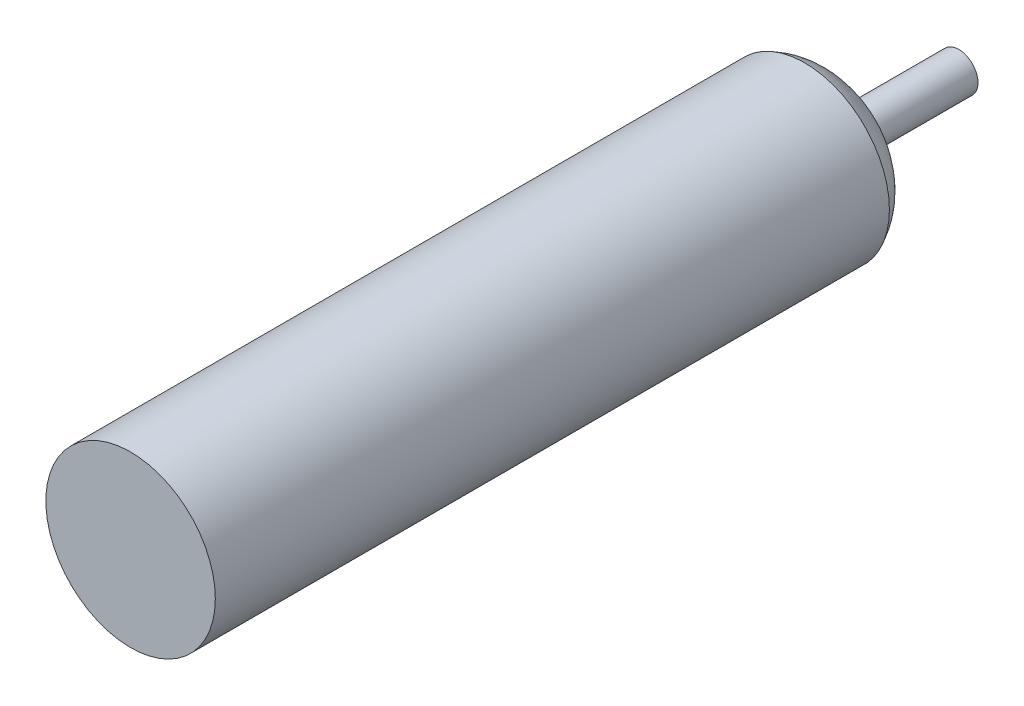
ISO-10303-21;
HEADER;
FILE_DESCRIPTION(('STEP AP214'),'2;1');
FILE_NAME('part.step','',(''),(''),'','','');
FILE_SCHEMA(('AUTOMOTIVE_DESIGN { 1 0 10303 214 1 1 1 1 }'));
ENDSEC;
DATA;
#1=APPLICATION_CONTEXT('core data for automotive mechanical design processes');
#2=APPLICATION_PROTOCOL_DEFINITION('international standard','automotive_design',2000,#1);
#3=PRODUCT_CONTEXT('',#1,'mechanical');
#4=PRODUCT('Part','Part','',(#3));
#5=PRODUCT_RELATED_PRODUCT_CATEGORY('part','',(#4));
#6=PRODUCT_DEFINITION_FORMATION('','',#4);
#7=PRODUCT_DEFINITION_CONTEXT('part definition',#1,'design');
#8=PRODUCT_DEFINITION('design','',#6,#7);
#9=PRODUCT_DEFINITION_SHAPE('','',#8);
#10=(LENGTH_UNIT() NAMED_UNIT(*) SI_UNIT(.MILLI.,.METRE.));
#11=(NAMED_UNIT(*) PLANE_ANGLE_UNIT() SI_UNIT($,.RADIAN.));
#12=(NAMED_UNIT(*) SI_UNIT($,.STERADIAN.) SOLID_ANGLE_UNIT());
#13=UNCERTAINTY_MEASURE_WITH_UNIT(LENGTH_MEASURE(1.E-05),#10,'distance_accuracy_value','');
#14=(GEOMETRIC_REPRESENTATION_CONTEXT(3) GLOBAL_UNCERTAINTY_ASSIGNED_CONTEXT((#13)) GLOBAL_UNIT_ASSIGNED_CONTEXT((#10,
#11,#12)) REPRESENTATION_CONTEXT('',''));
#15=CARTESIAN_POINT('',(0.,0.,0.));
#16=DIRECTION('',(0.,0.,1.));
#17=DIRECTION('',(1.,0.,0.));
#18=AXIS2_PLACEMENT_3D('',#15,#16,#17);
#19=CARTESIAN_POINT('',(0.,0.,444.5));
#20=DIRECTION('',(0.,0.,-1.));
#21=DIRECTION('',(-1.,0.,0.));
#22=AXIS2_PLACEMENT_3D('',#19,#20,#21);
#23=CYLINDRICAL_SURFACE('',#22,55.88);
#24=CARTESIAN_POINT('',(0.,0.,444.5));
#25=DIRECTION('',(0.,0.,1.));
#26=DIRECTION('',(1.,0.,0.));
#27=AXIS2_PLACEMENT_3D('',#24,#25,#26);
#28=CIRCLE('',#27,55.88);
#29=CARTESIAN_POINT('',(55.88,0.,444.5));
#30=VERTEX_POINT('',#29);
#31=EDGE_CURVE('E10',#30,#30,#28,.T.);
#32=ORIENTED_EDGE('',*,*,#31,.F.);
#33=EDGE_LOOP('',(#32));
#34=FACE_BOUND('',#33,.T.);
#35=CARTESIAN_POINT('',(0.,0.,0.));
#36=DIRECTION('',(0.,0.,1.));
#37=DIRECTION('',(1.,0.,0.));
#38=AXIS2_PLACEMENT_3D('',#35,#36,#37);
#39=CIRCLE('',#38,55.88);
#40=CARTESIAN_POINT('',(55.88,0.,0.));
#41=VERTEX_POINT('',#40);
#42=EDGE_CURVE('E44',#41,#41,#39,.T.);
#43=ORIENTED_EDGE('',*,*,#42,.T.);
#44=EDGE_LOOP('',(#43));
#45=FACE_BOUND('',#44,.T.);
#46=ADVANCED_FACE('F37',(#34,#45),#23,.T.);
#47=CARTESIAN_POINT('',(0.,0.,444.5));
#48=DIRECTION('',(0.,0.,1.));
#49=DIRECTION('',(1.,0.,0.));
#50=AXIS2_PLACEMENT_3D('',#47,#48,#49);
#51=PLANE('',#50);
#52=ORIENTED_EDGE('',*,*,#31,.T.);
#53=EDGE_LOOP('',(#52));
#54=FACE_BOUND('',#53,.T.);
#55=ADVANCED_FACE('F66',(#54),#51,.T.);
#56=CARTESIAN_POINT('',(0.,0.,18.9505295301244));
#57=DIRECTION('',(0.,0.,1.));
#58=DIRECTION('',(1.,0.,0.));
#59=AXIS2_PLACEMENT_3D('',#56,#57,#58);
#60=DEGENERATE_TOROIDAL_SURFACE('',#59,15.672041452868,44.45,.T.);
#61=CARTESIAN_POINT('',(0.,0.,-25.4));
#62=DIRECTION('',(0.,0.,-1.));
#63=DIRECTION('',(-1.,0.,0.));
#64=AXIS2_PLACEMENT_3D('',#61,#62,#63);
#65=CIRCLE('',#64,12.7);
#66=CARTESIAN_POINT('',(12.7,0.,-25.4));
#67=VERTEX_POINT('',#66);
#68=EDGE_CURVE('E54',#67,#67,#65,.T.);
#69=ORIENTED_EDGE('',*,*,#68,.F.);
#70=EDGE_LOOP('',(#69));
#71=FACE_BOUND('',#70,.T.);
#72=ORIENTED_EDGE('',*,*,#42,.F.);
#73=EDGE_LOOP('',(#72));
#74=FACE_BOUND('',#73,.T.);
#75=ADVANCED_FACE('F63',(#71,#74),#60,.T.);
#76=CARTESIAN_POINT('',(0.,0.,-101.6));
#77=DIRECTION('',(0.,0.,1.));
#78=DIRECTION('',(1.,0.,0.));
#79=AXIS2_PLACEMENT_3D('',#76,#77,#78);
#80=CYLINDRICAL_SURFACE('',#79,12.7);
#81=CARTESIAN_POINT('',(0.,0.,-101.6));
#82=DIRECTION('',(0.,0.,-1.));
#83=DIRECTION('',(-1.,0.,0.));
#84=AXIS2_PLACEMENT_3D('',#81,#82,#83);
#85=CIRCLE('',#84,12.7);
#86=CARTESIAN_POINT('',(12.7,0.,-101.6));
#87=VERTEX_POINT('',#86);
#88=EDGE_CURVE('E49',#87,#87,#85,.T.);
#89=CARTESIAN_POINT('',(12.7,0.,-101.6));
#90=CARTESIAN_POINT('',(12.7,0.,-100.80625));
#91=CARTESIAN_POINT('',(12.7,0.,-100.0125));
#92=CARTESIAN_POINT('',(12.7,0.,-98.425));
#93=CARTESIAN_POINT('',(12.7,0.,-97.63125));
#94=CARTESIAN_POINT('',(12.7,0.,-96.04375));
#95=CARTESIAN_POINT('',(12.7,0.,-95.25));
#96=CARTESIAN_POINT('',(12.7,0.,-93.6625));
#97=CARTESIAN_POINT('',(12.7,0.,-92.86875));
#98=CARTESIAN_POINT('',(12.7,0.,-91.28125));
#99=CARTESIAN_POINT('',(12.7,0.,-90.4875));
#100=CARTESIAN_POINT('',(12.7,0.,-88.9));
#101=CARTESIAN_POINT('',(12.7,0.,-88.10625));
#102=CARTESIAN_POINT('',(12.7,0.,-86.51875));
#103=CARTESIAN_POINT('',(12.7,0.,-85.725));
#104=CARTESIAN_POINT('',(12.7,0.,-84.1375));
#105=CARTESIAN_POINT('',(12.7,0.,-83.34375));
#106=CARTESIAN_POINT('',(12.7,0.,-81.75625));
#107=CARTESIAN_POINT('',(12.7,0.,-80.9625));
#108=CARTESIAN_POINT('',(12.7,0.,-79.375));
#109=CARTESIAN_POINT('',(12.7,0.,-78.58125));
#110=CARTESIAN_POINT('',(12.7,0.,-76.99375));
#111=CARTESIAN_POINT('',(12.7,0.,-76.2));
#112=CARTESIAN_POINT('',(12.7,0.,-74.6125));
#113=CARTESIAN_POINT('',(12.7,0.,-73.81875));
#114=CARTESIAN_POINT('',(12.7,0.,-72.23125));
#115=CARTESIAN_POINT('',(12.7,0.,-71.4375));
#116=CARTESIAN_POINT('',(12.7,0.,-69.85));
#117=CARTESIAN_POINT('',(12.7,0.,-69.05625));
#118=CARTESIAN_POINT('',(12.7,0.,-67.46875));
#119=CARTESIAN_POINT('',(12.7,0.,-66.675));
#120=CARTESIAN_POINT('',(12.7,0.,-65.0875));
#121=CARTESIAN_POINT('',(12.7,0.,-64.29375));
#122=CARTESIAN_POINT('',(12.7,0.,-62.70625));
#123=CARTESIAN_POINT('',(12.7,0.,-61.9125));
#124=CARTESIAN_POINT('',(12.7,0.,-60.325));
#125=CARTESIAN_POINT('',(12.7,0.,-59.53125));
#126=CARTESIAN_POINT('',(12.7,0.,-57.94375));
#127=CARTESIAN_POINT('',(12.7,0.,-57.15));
#128=CARTESIAN_POINT('',(12.7,0.,-55.5625));
#129=CARTESIAN_POINT('',(12.7,0.,-54.76875));
#130=CARTESIAN_POINT('',(12.7,0.,-53.18125));
#131=CARTESIAN_POINT('',(12.7,0.,-52.3875));
#132=CARTESIAN_POINT('',(12.7,0.,-50.8));
#133=CARTESIAN_POINT('',(12.7,0.,-50.00625));
#134=CARTESIAN_POINT('',(12.7,0.,-48.41875));
#135=CARTESIAN_POINT('',(12.7,0.,-47.625));
#136=CARTESIAN_POINT('',(12.7,0.,-46.0375));
#137=CARTESIAN_POINT('',(12.7,0.,-45.24375));
#138=CARTESIAN_POINT('',(12.7,0.,-43.65625));
#139=CARTESIAN_POINT('',(12.7,0.,-42.8625));
#140=CARTESIAN_POINT('',(12.7,0.,-41.275));
#141=CARTESIAN_POINT('',(12.7,0.,-40.48125));
#142=CARTESIAN_POINT('',(12.7,0.,-38.89375));
#143=CARTESIAN_POINT('',(12.7,0.,-38.1));
#144=CARTESIAN_POINT('',(12.7,0.,-36.5125));
#145=CARTESIAN_POINT('',(12.7,0.,-35.71875));
#146=CARTESIAN_POINT('',(12.7,0.,-34.13125));
#147=CARTESIAN_POINT('',(12.7,0.,-33.3375));
#148=CARTESIAN_POINT('',(12.7,0.,-31.75));
#149=CARTESIAN_POINT('',(12.7,0.,-30.95625));
#150=CARTESIAN_POINT('',(12.7,0.,-29.36875));
#151=CARTESIAN_POINT('',(12.7,0.,-28.575));
#152=CARTESIAN_POINT('',(12.7,0.,-26.9875));
#153=CARTESIAN_POINT('',(12.7,0.,-26.19375));
#154=CARTESIAN_POINT('',(12.7,0.,-25.4));
#155=B_SPLINE_CURVE_WITH_KNOTS('',3,(#89,#90,#91,#92,#93,#94,#95,#96,#97,#98,#99,#100,#101,#102,
#103,#104,#105,#106,#107,#108,#109,#110,#111,#112,#113,#114,#115,#116,#117,#118,#119,#120,#121,
#122,#123,#124,#125,#126,#127,#128,#129,#130,#131,#132,#133,#134,#135,#136,#137,#138,#139,#140,
#141,#142,#143,#144,#145,#146,#147,#148,#149,#150,#151,#152,#153,#154),.UNSPECIFIED.,.F.,.F.,(4,
2,2,2,2,2,2,2,2,2,2,2,2,2,2,2,2,2,2,2,2,2,2,2,2,2,2,2,2,2,2,2,4),(0.,2.38124999999999,
4.76249999999999,7.14374999999999,9.52499999999999,11.90625,14.2875,16.66875,19.05,21.43125,
23.8125,26.19375,28.575,30.95625,33.3375,35.71875,38.1,40.48125,42.8625,45.24375,47.625,
50.00625,52.3875,54.76875,57.15,59.53125,61.9125,64.29375,66.675,69.05625,71.4375,73.81875,
76.2),.UNSPECIFIED.);
#156=EDGE_CURVE('BSEAM61',#87,#67,#155,.T.);
#157=ORIENTED_EDGE('',*,*,#88,.F.);
#158=ORIENTED_EDGE('',*,*,#68,.T.);
#159=ORIENTED_EDGE('',*,*,#156,.T.);
#160=ORIENTED_EDGE('',*,*,#156,.F.);
#161=EDGE_LOOP('',(#157,#159,#158,#160));
#162=FACE_BOUND('',#161,.T.);
#163=ADVANCED_FACE('F61',(#162),#80,.T.);
#164=CARTESIAN_POINT('',(0.,0.,-101.6));
#165=DIRECTION('',(0.,0.,-1.));
#166=DIRECTION('',(-1.,0.,0.));
#167=AXIS2_PLACEMENT_3D('',#164,#165,#166);
#168=PLANE('',#167);
#169=ORIENTED_EDGE('',*,*,#88,.T.);
#170=EDGE_LOOP('',(#169));
#171=FACE_BOUND('',#170,.T.);
#172=ADVANCED_FACE('F72',(#171),#168,.T.);
#173=CLOSED_SHELL('',(#46,#55,#75,#163,#172));
#174=MANIFOLD_SOLID_BREP('B2',#173);
#175=ADVANCED_BREP_SHAPE_REPRESENTATION('',(#18,#174),#14);
#176=SHAPE_DEFINITION_REPRESENTATION(#9,#175);
ENDSEC;
END-ISO-10303-21;
